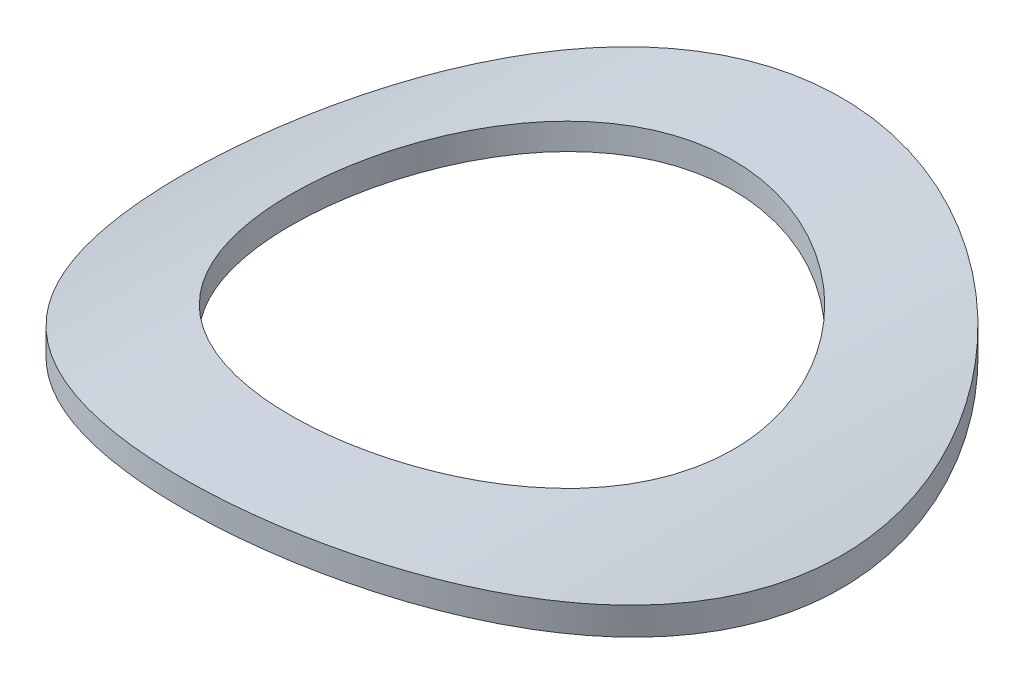
ISO-10303-21;
HEADER;
FILE_DESCRIPTION(('STEP AP214'),'2;1');
FILE_NAME('part.step','',(''),(''),'','','');
FILE_SCHEMA(('AUTOMOTIVE_DESIGN { 1 0 10303 214 1 1 1 1 }'));
ENDSEC;
DATA;
#1=APPLICATION_CONTEXT('core data for automotive mechanical design processes');
#2=APPLICATION_PROTOCOL_DEFINITION('international standard','automotive_design',2000,#1);
#3=PRODUCT_CONTEXT('',#1,'mechanical');
#4=PRODUCT('Part','Part','',(#3));
#5=PRODUCT_RELATED_PRODUCT_CATEGORY('part','',(#4));
#6=PRODUCT_DEFINITION_FORMATION('','',#4);
#7=PRODUCT_DEFINITION_CONTEXT('part definition',#1,'design');
#8=PRODUCT_DEFINITION('design','',#6,#7);
#9=PRODUCT_DEFINITION_SHAPE('','',#8);
#10=(LENGTH_UNIT() NAMED_UNIT(*) SI_UNIT(.MILLI.,.METRE.));
#11=(NAMED_UNIT(*) PLANE_ANGLE_UNIT() SI_UNIT($,.RADIAN.));
#12=(NAMED_UNIT(*) SI_UNIT($,.STERADIAN.) SOLID_ANGLE_UNIT());
#13=UNCERTAINTY_MEASURE_WITH_UNIT(LENGTH_MEASURE(1.E-05),#10,'distance_accuracy_value','');
#14=(GEOMETRIC_REPRESENTATION_CONTEXT(3) GLOBAL_UNCERTAINTY_ASSIGNED_CONTEXT((#13)) GLOBAL_UNIT_ASSIGNED_CONTEXT((#10,
#11,#12)) REPRESENTATION_CONTEXT('',''));
#15=CARTESIAN_POINT('',(0.,0.,0.));
#16=DIRECTION('',(0.,0.,1.));
#17=DIRECTION('',(1.,0.,0.));
#18=AXIS2_PLACEMENT_3D('',#15,#16,#17);
#19=CARTESIAN_POINT('',(0.,-17.25,-7.6));
#20=DIRECTION('',(0.,0.,1.));
#21=DIRECTION('',(1.,0.,0.));
#22=AXIS2_PLACEMENT_3D('',#19,#20,#21);
#23=CYLINDRICAL_SURFACE('',#22,19.45);
#24=CARTESIAN_POINT('',(5.1,1.51945657178172,0.));
#25=CARTESIAN_POINT('',(5.0999995055215,1.51945691479147,0.140459049564521));
#26=CARTESIAN_POINT('',(5.0941924376075,1.52103754174586,0.280929262328434));
#27=CARTESIAN_POINT('',(5.07100961408821,1.52731351725321,0.560894504581965));
#28=CARTESIAN_POINT('',(5.0536289591616,1.53201018488288,0.700389095790963));
#29=CARTESIAN_POINT('',(5.00741209276804,1.54438470539764,0.977542067257098));
#30=CARTESIAN_POINT('',(4.97855930756364,1.55206687105464,1.11519749177534));
#31=CARTESIAN_POINT('',(4.90963193204747,1.57018284917099,1.38753581700298));
#32=CARTESIAN_POINT('',(4.86955301661376,1.58061772208306,1.52221755041175));
#33=CARTESIAN_POINT('',(4.77860264542307,1.60390287113796,1.78732810804574));
#34=CARTESIAN_POINT('',(4.72775629495453,1.61674752084753,1.91776602480149));
#35=CARTESIAN_POINT('',(4.61561545723657,1.64449457072468,2.17386009726463));
#36=CARTESIAN_POINT('',(4.55431710044392,1.6593977326054,2.29951446085244));
#37=CARTESIAN_POINT('',(4.35545880149484,1.70655745749262,2.66789616755649));
#38=CARTESIAN_POINT('',(4.20281775822918,1.74129594913406,2.9023839490367));
#39=CARTESIAN_POINT('',(3.85791962247936,1.81438067490833,3.34778045889317));
#40=CARTESIAN_POINT('',(3.66486599626507,1.85278939379981,3.55805813119978));
#41=CARTESIAN_POINT('',(3.24625726040622,1.92835969212124,3.94370001733728));
#42=CARTESIAN_POINT('',(3.02069710709718,1.96552107691146,4.11905880313067));
#43=CARTESIAN_POINT('',(2.53919520468261,2.03509721029681,4.43240987883686));
#44=CARTESIAN_POINT('',(2.28283842813576,2.06742988535398,4.56978395958309));
#45=CARTESIAN_POINT('',(1.74967938809728,2.12299270365513,4.7992501462647));
#46=CARTESIAN_POINT('',(1.47288061440534,2.14622439634323,4.89134996083421));
#47=CARTESIAN_POINT('',(0.91321173232183,2.18052674138492,5.0256357153759));
#48=CARTESIAN_POINT('',(0.630612516031051,2.19185573195099,5.06888358139553));
#49=CARTESIAN_POINT('',(0.0619570317405978,2.20197857941085,5.10757687551928));
#50=CARTESIAN_POINT('',(-0.224098672677855,2.20077445300421,5.10302999425873));
#51=CARTESIAN_POINT('',(-0.784158017515786,2.18615732041152,5.04701754793936));
#52=CARTESIAN_POINT('',(-1.05828543161784,2.17304286698965,4.99669927219588));
#53=CARTESIAN_POINT('',(-1.59406896440079,2.13642783501373,4.85241318314029));
#54=CARTESIAN_POINT('',(-1.85572430669385,2.11292661081505,4.75844265637331));
#55=CARTESIAN_POINT('',(-2.36206344425537,2.05773764935841,4.5286599533239));
#56=CARTESIAN_POINT('',(-2.60655738880999,2.02597250121336,4.39244965238628));
#57=CARTESIAN_POINT('',(-3.06968933879348,1.95766328235134,4.0822316435626));
#58=CARTESIAN_POINT('',(-3.28832411394838,1.92111861578497,3.90821922119923));
#59=CARTESIAN_POINT('',(-3.59561752020098,1.86505650271099,3.61968900929857));
#60=CARTESIAN_POINT('',(-3.69591170001624,1.8458713545213,3.5172144575119));
#61=CARTESIAN_POINT('',(-3.88753703452479,1.80778253743019,3.30417142160758));
#62=CARTESIAN_POINT('',(-3.97887131794118,1.78887877224213,3.19360578654674));
#63=CARTESIAN_POINT('',(-4.15203074013893,1.75186822047858,2.9650005291287));
#64=CARTESIAN_POINT('',(-4.23384790179827,1.73376211027129,2.84695476322237));
#65=CARTESIAN_POINT('',(-4.38728735966358,1.69888908636681,2.60428608721129));
#66=CARTESIAN_POINT('',(-4.45891360057449,1.68212165560216,2.47966574774045));
#67=CARTESIAN_POINT('',(-4.59193756599135,1.65029953889609,2.22374728651684));
#68=CARTESIAN_POINT('',(-4.6532603983914,1.63525762611291,2.0924086221412));
#69=CARTESIAN_POINT('',(-4.7645548928216,1.6074867778409,1.82482958164356));
#70=CARTESIAN_POINT('',(-4.81453111506859,1.59475691354984,1.68859120031664));
#71=CARTESIAN_POINT('',(-4.90267108404863,1.57201865087814,1.41237340379724));
#72=CARTESIAN_POINT('',(-4.94085422514447,1.56200578757121,1.27240054655474));
#73=CARTESIAN_POINT('',(-5.00516958299292,1.54499635841586,0.989592030091544));
#74=CARTESIAN_POINT('',(-5.03130744982162,1.53799837847682,0.84675774595612));
#75=CARTESIAN_POINT('',(-5.06750973050379,1.52826188749747,0.586648031892184));
#76=CARTESIAN_POINT('',(-5.07968663669637,1.52496615379009,0.469682651317227));
#77=CARTESIAN_POINT('',(-5.0959319941079,1.5205633481283,0.235147456179601));
#78=CARTESIAN_POINT('',(-5.10000041392573,1.51945628464979,0.117577639277946));
#79=CARTESIAN_POINT('',(-5.0999995055215,1.51945691479147,-0.140459049564521));
#80=CARTESIAN_POINT('',(-5.0941924376075,1.52103754174586,-0.280929262328434));
#81=CARTESIAN_POINT('',(-5.07100961408821,1.52731351725321,-0.560894504581965));
#82=CARTESIAN_POINT('',(-5.0536289591616,1.53201018488287,-0.700389095790963));
#83=CARTESIAN_POINT('',(-5.00741209276804,1.54438470539764,-0.977542067257097));
#84=CARTESIAN_POINT('',(-4.97855930756364,1.55206687105464,-1.11519749177534));
#85=CARTESIAN_POINT('',(-4.90963193204747,1.57018284917099,-1.38753581700298));
#86=CARTESIAN_POINT('',(-4.86955301661376,1.58061772208306,-1.52221755041175));
#87=CARTESIAN_POINT('',(-4.77860264542307,1.60390287113796,-1.78732810804574));
#88=CARTESIAN_POINT('',(-4.72775629495453,1.61674752084753,-1.91776602480149));
#89=CARTESIAN_POINT('',(-4.61561545723657,1.64449457072468,-2.17386009726464));
#90=CARTESIAN_POINT('',(-4.55431710044392,1.6593977326054,-2.29951446085244));
#91=CARTESIAN_POINT('',(-4.35545880149484,1.70655745749262,-2.66789616755649));
#92=CARTESIAN_POINT('',(-4.20281775822918,1.74129594913406,-2.9023839490367));
#93=CARTESIAN_POINT('',(-3.85791962247936,1.81438067490833,-3.34778045889317));
#94=CARTESIAN_POINT('',(-3.66486599626507,1.85278939379982,-3.55805813119978));
#95=CARTESIAN_POINT('',(-3.24625726040622,1.92835969212124,-3.94370001733728));
#96=CARTESIAN_POINT('',(-3.02069710709718,1.96552107691146,-4.11905880313066));
#97=CARTESIAN_POINT('',(-2.53919520468261,2.03509721029681,-4.43240987883686));
#98=CARTESIAN_POINT('',(-2.28283842813576,2.06742988535398,-4.56978395958309));
#99=CARTESIAN_POINT('',(-1.74967938809728,2.12299270365513,-4.7992501462647));
#100=CARTESIAN_POINT('',(-1.47288061440533,2.14622439634323,-4.89134996083421));
#101=CARTESIAN_POINT('',(-0.91321173232183,2.18052674138492,-5.0256357153759));
#102=CARTESIAN_POINT('',(-0.630612516031051,2.19185573195099,-5.06888358139553));
#103=CARTESIAN_POINT('',(-0.0619570317405986,2.20197857941085,-5.10757687551928));
#104=CARTESIAN_POINT('',(0.224098672677855,2.20077445300421,-5.10302999425873));
#105=CARTESIAN_POINT('',(0.784158017515786,2.18615732041152,-5.04701754793936));
#106=CARTESIAN_POINT('',(1.05828543161784,2.17304286698965,-4.99669927219588));
#107=CARTESIAN_POINT('',(1.59406896440079,2.13642783501373,-4.85241318314029));
#108=CARTESIAN_POINT('',(1.85572430669385,2.11292661081505,-4.75844265637331));
#109=CARTESIAN_POINT('',(2.36206344425537,2.05773764935841,-4.5286599533239));
#110=CARTESIAN_POINT('',(2.60655738880999,2.02597250121336,-4.39244965238628));
#111=CARTESIAN_POINT('',(3.06968933879348,1.95766328235134,-4.0822316435626));
#112=CARTESIAN_POINT('',(3.28832411394838,1.92111861578497,-3.90821922119923));
#113=CARTESIAN_POINT('',(3.59561752020098,1.86505650271099,-3.61968900929857));
#114=CARTESIAN_POINT('',(3.69591170001624,1.84587135452131,-3.51721445751189));
#115=CARTESIAN_POINT('',(3.88753703452479,1.80778253743019,-3.30417142160758));
#116=CARTESIAN_POINT('',(3.97887131794118,1.78887877224213,-3.19360578654674));
#117=CARTESIAN_POINT('',(4.15203074013893,1.75186822047858,-2.9650005291287));
#118=CARTESIAN_POINT('',(4.23384790179827,1.73376211027129,-2.84695476322237));
#119=CARTESIAN_POINT('',(4.38728735966358,1.6988890863668,-2.60428608721129));
#120=CARTESIAN_POINT('',(4.45891360057449,1.68212165560216,-2.47966574774044));
#121=CARTESIAN_POINT('',(4.59193756599135,1.65029953889609,-2.22374728651684));
#122=CARTESIAN_POINT('',(4.6532603983914,1.63525762611291,-2.0924086221412));
#123=CARTESIAN_POINT('',(4.7645548928216,1.6074867778409,-1.82482958164356));
#124=CARTESIAN_POINT('',(4.81453111506859,1.59475691354984,-1.68859120031664));
#125=CARTESIAN_POINT('',(4.90267108404863,1.57201865087814,-1.41237340379724));
#126=CARTESIAN_POINT('',(4.94085422514447,1.56200578757121,-1.27240054655474));
#127=CARTESIAN_POINT('',(5.00516958299292,1.54499635841586,-0.989592030091542));
#128=CARTESIAN_POINT('',(5.03130744982162,1.53799837847682,-0.846757745956118));
#129=CARTESIAN_POINT('',(5.06750973050379,1.52826188749747,-0.586648031892182));
#130=CARTESIAN_POINT('',(5.07968663669637,1.52496615379009,-0.469682651317224));
#131=CARTESIAN_POINT('',(5.0959319941079,1.5205633481283,-0.235147456179599));
#132=CARTESIAN_POINT('',(5.10000041392573,1.51945628464979,-0.117577639277945));
#133=CARTESIAN_POINT('',(5.1,1.51945657178172,0.));
#134=B_SPLINE_CURVE_WITH_KNOTS('',3,(#24,#25,#26,#27,#28,#29,#30,#31,#32,#33,#34,#35,#36,#37,
#38,#39,#40,#41,#42,#43,#44,#45,#46,#47,#48,#49,#50,#51,#52,#53,#54,#55,#56,#57,#58,#59,#60,#61,
#62,#63,#64,#65,#66,#67,#68,#69,#70,#71,#72,#73,#74,#75,#76,#77,#78,#79,#80,#81,#82,#83,#84,#85,
#86,#87,#88,#89,#90,#91,#92,#93,#94,#95,#96,#97,#98,#99,#100,#101,#102,#103,#104,#105,#106,#107,
#108,#109,#110,#111,#112,#113,#114,#115,#116,#117,#118,#119,#120,#121,#122,#123,#124,#125,#126,
#127,#128,#129,#130,#131,#132,#133),.UNSPECIFIED.,.T.,.F.,(4,2,2,2,2,2,2,2,2,2,2,2,2,2,2,2,2,2,
2,2,2,2,2,2,2,2,2,2,2,2,2,2,2,2,2,2,2,2,2,2,2,2,2,2,2,2,2,2,2,2,2,2,2,2,4),(0.,
0.421268041752624,0.842714527811129,1.26477210105007,1.68699250575988,2.10823909461977,
2.52964197741624,3.37137209843634,4.23159109251464,5.09194370088123,5.96556941520808,
6.83904632987109,7.69314676224187,8.5471097637282,9.38024029971198,10.2134226306119,
11.0547097822138,11.896101914921,12.329680248893,12.7631066378447,13.1968937402841,
13.6305124727762,14.067158149881,14.5036280266644,14.9393762352593,15.3749198388972,
15.7275600581605,16.0802016430643,16.5014696848169,16.9229161708754,17.3449737441144,
17.7671941488242,18.1884407376841,18.6098436204805,19.4515737415006,20.3117927355789,
21.1721453439455,22.0457710582724,22.9192479729354,23.7733484053062,24.6273114067925,
25.4604419427763,26.2936242736762,27.1349114252781,27.9763035579853,28.4098818919573,
28.843308280909,29.2770953833484,29.7107141158405,30.1473597929453,30.5838296697287,
31.0195778783236,31.4551214819615,31.8077617012248,32.1604032861286),.UNSPECIFIED.);
#135=CARTESIAN_POINT('',(5.1,1.51945657178172,0.));
#136=VERTEX_POINT('',#135);
#137=EDGE_CURVE('E30',#136,#136,#134,.T.);
#138=ORIENTED_EDGE('',*,*,#137,.T.);
#139=EDGE_LOOP('',(#138));
#140=FACE_BOUND('',#139,.T.);
#141=CARTESIAN_POINT('',(7.6,0.653700734764303,0.));
#142=CARTESIAN_POINT('',(7.60000082840708,0.653699940658333,0.204262338696853));
#143=CARTESIAN_POINT('',(7.59175816554607,0.657205939323997,0.408513207996823));
#144=CARTESIAN_POINT('',(7.55887642501754,0.671110676428484,0.815525804972903));
#145=CARTESIAN_POINT('',(7.5342318582405,0.681511722379575,1.01828701113874));
#146=CARTESIAN_POINT('',(7.46877007382527,0.708876029999964,1.42096145632324));
#147=CARTESIAN_POINT('',(7.42793459606296,0.725846700384945,1.62087121484879));
#148=CARTESIAN_POINT('',(7.33049357472522,0.765802302335084,2.01627023682255));
#149=CARTESIAN_POINT('',(7.2738817160012,0.788789642096428,2.21175769611239));
#150=CARTESIAN_POINT('',(7.14566096643968,0.839963296910349,2.5962345523922));
#151=CARTESIAN_POINT('',(7.07410835562739,0.86813005548864,2.78524532122871));
#152=CARTESIAN_POINT('',(6.91648614496346,0.928884498257419,3.1564097977865));
#153=CARTESIAN_POINT('',(6.8304110362667,0.96147385916023,3.33856087121406));
#154=CARTESIAN_POINT('',(6.55144717658291,1.06448619826455,3.8729575176302));
#155=CARTESIAN_POINT('',(6.3376901737302,1.14020773704166,4.2135323857874));
#156=CARTESIAN_POINT('',(5.84829227914084,1.30180026154841,4.87174268320073));
#157=CARTESIAN_POINT('',(5.5701191515004,1.38798763335448,5.18741819516329));
#158=CARTESIAN_POINT('',(5.11673990351057,1.51556048315537,5.62344157799068));
#159=CARTESIAN_POINT('',(4.95948003249655,1.5578268731821,5.76261232122527));
#160=CARTESIAN_POINT('',(4.63374418144359,1.64071486539538,6.02763997537671));
#161=CARTESIAN_POINT('',(4.46527240455153,1.68133707487406,6.15350183026145));
#162=CARTESIAN_POINT('',(4.11146340735519,1.76137828121062,6.39558846446134));
#163=CARTESIAN_POINT('',(3.9257289845802,1.80069332960194,6.51126722478913));
#164=CARTESIAN_POINT('',(3.54442904715389,1.87530356631025,6.72643419937395));
#165=CARTESIAN_POINT('',(3.34886756310875,1.91060038363254,6.82592898173956));
#166=CARTESIAN_POINT('',(2.94917751258632,1.9761763535403,7.00789291362318));
#167=CARTESIAN_POINT('',(2.74504957671828,2.00645587465895,7.09036331373485));
#168=CARTESIAN_POINT('',(2.32970005950517,2.06110713017071,7.23747379207806));
#169=CARTESIAN_POINT('',(2.11847890922304,2.08547922282811,7.30211495162172));
#170=CARTESIAN_POINT('',(1.70052618147932,2.12660286108871,7.41030514576674));
#171=CARTESIAN_POINT('',(1.49404152402996,2.14365569999786,7.454694169765));
#172=CARTESIAN_POINT('',(1.07766709955484,2.17124240312634,7.52617078375809));
#173=CARTESIAN_POINT('',(0.86777742902842,2.18177645176053,7.55325886319277));
#174=CARTESIAN_POINT('',(0.446302755223483,2.19602175342244,7.58983174850123));
#175=CARTESIAN_POINT('',(0.234718283637048,2.19973506806409,7.59932187348649));
#176=CARTESIAN_POINT('',(-0.188509363462097,2.20023748637448,7.60060788740271));
#177=CARTESIAN_POINT('',(-0.400152536787321,2.1970268204271,7.59240436506022));
#178=CARTESIAN_POINT('',(-0.810423651818083,2.18413356708439,7.55931614827899));
#179=CARTESIAN_POINT('',(-1.00913814664148,2.17480921347336,7.5353545811796));
#180=CARTESIAN_POINT('',(-1.40377542848444,2.15028380744447,7.47190526473971));
#181=CARTESIAN_POINT('',(-1.59969721401143,2.13508069921948,7.43241208389386));
#182=CARTESIAN_POINT('',(-1.98728019724418,2.09918827626979,7.33828840918381));
#183=CARTESIAN_POINT('',(-2.17894280169708,2.07850080304394,7.28366299603068));
#184=CARTESIAN_POINT('',(-2.55691570860544,2.0321407893903,7.15973148649452));
#185=CARTESIAN_POINT('',(-2.74322394914583,2.00646635729504,7.09041981836999));
#186=CARTESIAN_POINT('',(-3.1119499955221,1.95035287411044,6.93658793173772));
#187=CARTESIAN_POINT('',(-3.29427190052526,1.91984999656532,6.85186131047769));
#188=CARTESIAN_POINT('',(-3.65117128170295,1.85508722102892,6.66852400241803));
#189=CARTESIAN_POINT('',(-3.82574609487283,1.82082604498767,6.56990858932812));
#190=CARTESIAN_POINT('',(-4.16614347214224,1.74936834877224,6.35950366141659));
#191=CARTESIAN_POINT('',(-4.33196554906473,1.71217166549471,6.24771341440126));
#192=CARTESIAN_POINT('',(-4.6539910843718,1.63571577071257,6.01167414707419));
#193=CARTESIAN_POINT('',(-4.81019405879271,1.5964564556151,5.88742450072086));
#194=CARTESIAN_POINT('',(-5.12171594429099,1.5142768615689,5.61897899667899));
#195=CARTESIAN_POINT('',(-5.27635770379492,1.47128185517238,5.47401936531057));
#196=CARTESIAN_POINT('',(-5.57293524634645,1.38514787896648,5.17177052949279));
#197=CARTESIAN_POINT('',(-5.71487476339513,1.34200895535715,5.01448497409105));
#198=CARTESIAN_POINT('',(-5.98538320348433,1.25669673006288,4.6882962532));
#199=CARTESIAN_POINT('',(-6.11393934371681,1.21452438101499,4.51938223223143));
#200=CARTESIAN_POINT('',(-6.35664863185115,1.13238099167278,4.17109736042881));
#201=CARTESIAN_POINT('',(-6.47080735951955,1.09240910198827,3.9917306002381));
#202=CARTESIAN_POINT('',(-6.68685357001989,1.01477555650535,3.61852509604772));
#203=CARTESIAN_POINT('',(-6.78832521764417,0.977205729248827,3.42442603300474));
#204=CARTESIAN_POINT('',(-6.97437438675396,0.906830599920644,3.02755812772828));
#205=CARTESIAN_POINT('',(-7.05895915961184,0.874023254456094,2.82479305236483));
#206=CARTESIAN_POINT('',(-7.21035324383948,0.814327405980907,2.41225990508754));
#207=CARTESIAN_POINT('',(-7.27719150277113,0.787429276567761,2.20250387365791));
#208=CARTESIAN_POINT('',(-7.39252989755894,0.740466499452067,1.77735467285065));
#209=CARTESIAN_POINT('',(-7.4410383368282,0.720398757991867,1.56196410331554));
#210=CARTESIAN_POINT('',(-7.51989763002584,0.687544595909176,1.12325674245395));
#211=CARTESIAN_POINT('',(-7.5499021973274,0.674897242288431,0.899867040973357));
#212=CARTESIAN_POINT('',(-7.58995287653727,0.657975770383791,0.450980227392368));
#213=CARTESIAN_POINT('',(-7.59999908552981,0.653701611369836,0.225483125548448));
#214=CARTESIAN_POINT('',(-7.60000082840708,0.653699940658331,-0.204262338696853));
#215=CARTESIAN_POINT('',(-7.59175816554607,0.657205939323995,-0.408513207996824));
#216=CARTESIAN_POINT('',(-7.55887642501754,0.671110676428483,-0.815525804972904));
#217=CARTESIAN_POINT('',(-7.5342318582405,0.681511722379575,-1.01828701113874));
#218=CARTESIAN_POINT('',(-7.46877007382527,0.708876029999965,-1.42096145632324));
#219=CARTESIAN_POINT('',(-7.42793459606296,0.725846700384946,-1.6208712148488));
#220=CARTESIAN_POINT('',(-7.33049357472522,0.765802302335084,-2.01627023682255));
#221=CARTESIAN_POINT('',(-7.2738817160012,0.788789642096429,-2.21175769611239));
#222=CARTESIAN_POINT('',(-7.14566096643968,0.839963296910351,-2.5962345523922));
#223=CARTESIAN_POINT('',(-7.07410835562739,0.868130055488643,-2.78524532122871));
#224=CARTESIAN_POINT('',(-6.91648614496346,0.928884498257421,-3.15640979778651));
#225=CARTESIAN_POINT('',(-6.83041103626669,0.961473859160232,-3.33856087121407));
#226=CARTESIAN_POINT('',(-6.55144717658291,1.06448619826455,-3.8729575176302));
#227=CARTESIAN_POINT('',(-6.3376901737302,1.14020773704166,-4.2135323857874));
#228=CARTESIAN_POINT('',(-5.84829227914084,1.30180026154841,-4.87174268320073));
#229=CARTESIAN_POINT('',(-5.5701191515004,1.38798763335448,-5.18741819516329));
#230=CARTESIAN_POINT('',(-5.11673990351057,1.51556048315537,-5.62344157799068));
#231=CARTESIAN_POINT('',(-4.95948003249655,1.5578268731821,-5.76261232122527));
#232=CARTESIAN_POINT('',(-4.63374418144359,1.64071486539538,-6.02763997537671));
#233=CARTESIAN_POINT('',(-4.46527240455152,1.68133707487406,-6.15350183026145));
#234=CARTESIAN_POINT('',(-4.11146340735519,1.76137828121062,-6.39558846446134));
#235=CARTESIAN_POINT('',(-3.9257289845802,1.80069332960194,-6.51126722478913));
#236=CARTESIAN_POINT('',(-3.54442904715389,1.87530356631025,-6.72643419937394));
#237=CARTESIAN_POINT('',(-3.34886756310875,1.91060038363254,-6.82592898173956));
#238=CARTESIAN_POINT('',(-2.94917751258631,1.9761763535403,-7.00789291362318));
#239=CARTESIAN_POINT('',(-2.74504957671828,2.00645587465895,-7.09036331373485));
#240=CARTESIAN_POINT('',(-2.32970005950517,2.06110713017071,-7.23747379207806));
#241=CARTESIAN_POINT('',(-2.11847890922304,2.08547922282811,-7.30211495162172));
#242=CARTESIAN_POINT('',(-1.70052618147932,2.12660286108871,-7.41030514576674));
#243=CARTESIAN_POINT('',(-1.49404152402996,2.14365569999786,-7.454694169765));
#244=CARTESIAN_POINT('',(-1.07766709955484,2.17124240312634,-7.52617078375809));
#245=CARTESIAN_POINT('',(-0.867777429028417,2.18177645176053,-7.55325886319277));
#246=CARTESIAN_POINT('',(-0.446302755223478,2.19602175342244,-7.58983174850123));
#247=CARTESIAN_POINT('',(-0.234718283637042,2.19973506806409,-7.59932187348649));
#248=CARTESIAN_POINT('',(0.188509363462102,2.20023748637448,-7.60060788740271));
#249=CARTESIAN_POINT('',(0.400152536787324,2.1970268204271,-7.59240436506022));
#250=CARTESIAN_POINT('',(0.810423651818084,2.18413356708439,-7.55931614827899));
#251=CARTESIAN_POINT('',(1.00913814664148,2.17480921347336,-7.5353545811796));
#252=CARTESIAN_POINT('',(1.40377542848444,2.15028380744447,-7.47190526473971));
#253=CARTESIAN_POINT('',(1.59969721401143,2.13508069921948,-7.43241208389386));
#254=CARTESIAN_POINT('',(1.98728019724418,2.09918827626979,-7.33828840918381));
#255=CARTESIAN_POINT('',(2.17894280169708,2.07850080304394,-7.28366299603068));
#256=CARTESIAN_POINT('',(2.55691570860544,2.0321407893903,-7.15973148649452));
#257=CARTESIAN_POINT('',(2.74322394914583,2.00646635729504,-7.09041981836999));
#258=CARTESIAN_POINT('',(3.1119499955221,1.95035287411044,-6.93658793173772));
#259=CARTESIAN_POINT('',(3.29427190052526,1.91984999656532,-6.85186131047769));
#260=CARTESIAN_POINT('',(3.65117128170296,1.85508722102892,-6.66852400241803));
#261=CARTESIAN_POINT('',(3.82574609487283,1.82082604498767,-6.56990858932812));
#262=CARTESIAN_POINT('',(4.16614347214225,1.74936834877224,-6.35950366141659));
#263=CARTESIAN_POINT('',(4.33196554906473,1.71217166549471,-6.24771341440126));
#264=CARTESIAN_POINT('',(4.6539910843718,1.63571577071257,-6.01167414707418));
#265=CARTESIAN_POINT('',(4.81019405879271,1.5964564556151,-5.88742450072086));
#266=CARTESIAN_POINT('',(5.12171594429099,1.5142768615689,-5.61897899667899));
#267=CARTESIAN_POINT('',(5.27635770379492,1.47128185517238,-5.47401936531057));
#268=CARTESIAN_POINT('',(5.57293524634646,1.38514787896648,-5.17177052949279));
#269=CARTESIAN_POINT('',(5.71487476339513,1.34200895535716,-5.01448497409105));
#270=CARTESIAN_POINT('',(5.98538320348433,1.25669673006288,-4.6882962532));
#271=CARTESIAN_POINT('',(6.11393934371681,1.21452438101499,-4.51938223223143));
#272=CARTESIAN_POINT('',(6.35664863185115,1.13238099167278,-4.17109736042881));
#273=CARTESIAN_POINT('',(6.47080735951955,1.09240910198827,-3.9917306002381));
#274=CARTESIAN_POINT('',(6.68685357001989,1.01477555650535,-3.61852509604772));
#275=CARTESIAN_POINT('',(6.78832521764417,0.977205729248828,-3.42442603300473));
#276=CARTESIAN_POINT('',(6.97437438675396,0.906830599920645,-3.02755812772827));
#277=CARTESIAN_POINT('',(7.05895915961184,0.874023254456096,-2.82479305236482));
#278=CARTESIAN_POINT('',(7.21035324383948,0.814327405980907,-2.41225990508754));
#279=CARTESIAN_POINT('',(7.27719150277113,0.78742927656776,-2.20250387365791));
#280=CARTESIAN_POINT('',(7.39252989755894,0.740466499452067,-1.77735467285065));
#281=CARTESIAN_POINT('',(7.4410383368282,0.720398757991869,-1.56196410331554));
#282=CARTESIAN_POINT('',(7.51989763002585,0.687544595909176,-1.12325674245395));
#283=CARTESIAN_POINT('',(7.5499021973274,0.674897242288428,-0.899867040973354));
#284=CARTESIAN_POINT('',(7.58995287653727,0.657975770383788,-0.450980227392366));
#285=CARTESIAN_POINT('',(7.59999908552981,0.653701611369835,-0.225483125548447));
#286=CARTESIAN_POINT('',(7.6,0.653700734764303,0.));
#287=B_SPLINE_CURVE_WITH_KNOTS('',3,(#141,#142,#143,#144,#145,#146,#147,#148,#149,#150,#151,
#152,#153,#154,#155,#156,#157,#158,#159,#160,#161,#162,#163,#164,#165,#166,#167,#168,#169,#170,
#171,#172,#173,#174,#175,#176,#177,#178,#179,#180,#181,#182,#183,#184,#185,#186,#187,#188,#189,
#190,#191,#192,#193,#194,#195,#196,#197,#198,#199,#200,#201,#202,#203,#204,#205,#206,#207,#208,
#209,#210,#211,#212,#213,#214,#215,#216,#217,#218,#219,#220,#221,#222,#223,#224,#225,#226,#227,
#228,#229,#230,#231,#232,#233,#234,#235,#236,#237,#238,#239,#240,#241,#242,#243,#244,#245,#246,
#247,#248,#249,#250,#251,#252,#253,#254,#255,#256,#257,#258,#259,#260,#261,#262,#263,#264,#265,
#266,#267,#268,#269,#270,#271,#272,#273,#274,#275,#276,#277,#278,#279,#280,#281,#282,#283,#284,
#285,#286),.UNSPECIFIED.,.T.,.F.,(4,2,2,2,2,2,2,2,2,2,2,2,2,2,2,2,2,2,2,2,2,2,2,2,2,2,2,2,2,2,2,
2,2,2,2,2,2,2,2,2,2,2,2,2,2,2,2,2,2,2,2,2,2,2,2,2,2,2,2,2,2,2,2,2,2,2,2,2,2,2,2,2,4),(0.,
0.612572132762226,1.2253493738759,1.83881968051122,2.45253590760196,3.06398074808422,
3.67565805266354,4.89779505361605,6.18021019925017,6.82224959979413,7.46404965227148,
8.1301734112275,8.79602615223332,9.46182996295957,10.1275933849706,10.7624440044546,
11.3972766633609,12.0319174081191,12.6665370365933,13.2669441925588,13.8675615017468,
14.4679773950388,15.0686214861458,15.6779954696149,16.2875773234812,16.897193070956,
17.50683946487,18.1549376076639,18.8028446028267,19.4513648601337,20.0996330037616,
20.7654497245136,21.430979919841,22.0954177592747,22.7595542463247,23.4357697047914,
24.1119818739084,24.7245540066706,25.3373312477843,25.9508015544196,26.5645177815104,
27.1759626219926,27.7876399265719,29.0097769275244,30.2921920731586,30.9342314737025,
31.5760315261799,32.2421552851359,32.9080080261417,33.573811836868,34.239575258879,
34.874425878363,35.5092585372693,36.1438992820275,36.7785189105017,37.3789260664672,
37.9795433756552,38.5799592689472,39.1806033600541,39.7899773435233,40.3995591973896,
41.0091749448644,41.6188213387784,42.2669194815723,42.9148264767351,43.5633467340421,
44.21161487767,44.877431598422,45.5429617937494,46.2073996331831,46.8715361202331,
47.5477515786998,48.2239637478168),.UNSPECIFIED.);
#288=CARTESIAN_POINT('',(7.6,0.653700734764303,0.));
#289=VERTEX_POINT('',#288);
#290=EDGE_CURVE('E19',#289,#289,#287,.T.);
#291=ORIENTED_EDGE('',*,*,#290,.F.);
#292=EDGE_LOOP('',(#291));
#293=FACE_BOUND('',#292,.T.);
#294=ADVANCED_FACE('F15',(#140,#293),#23,.T.);
#295=CARTESIAN_POINT('',(0.,0.,0.));
#296=DIRECTION('',(0.,-1.,0.));
#297=DIRECTION('',(0.,0.,-1.));
#298=AXIS2_PLACEMENT_3D('',#295,#296,#297);
#299=CYLINDRICAL_SURFACE('',#298,7.6);
#300=CARTESIAN_POINT('',(-7.6,0.,-7.36903778873255E-12));
#301=CARTESIAN_POINT('',(-7.60000110964854,-1.10445191078352E-06,0.203660363123225));
#302=CARTESIAN_POINT('',(-7.5918067072255,0.00361660802503066,0.407305800548011));
#303=CARTESIAN_POINT('',(-7.55912075671777,0.017962107312225,0.813102730656948));
#304=CARTESIAN_POINT('',(-7.53462393077742,0.0286921967264984,1.01525371808073));
#305=CARTESIAN_POINT('',(-7.46956312988187,0.0569171030610864,1.4166942061986));
#306=CARTESIAN_POINT('',(-7.42898158240564,0.0744193180138727,1.61598032945452));
#307=CARTESIAN_POINT('',(-7.33216026694697,0.11561803150487,2.01013209502748));
#308=CARTESIAN_POINT('',(-7.27591419687139,0.139317022872361,2.20499592398775));
#309=CARTESIAN_POINT('',(-7.14855179665447,0.192059362648362,2.58820566578004));
#310=CARTESIAN_POINT('',(-7.07749386684327,0.221081669834561,2.77657388777486));
#311=CARTESIAN_POINT('',(-6.92098440683489,0.283669522206381,3.14648326657419));
#312=CARTESIAN_POINT('',(-6.83552740616438,0.317236793152167,3.32802179646586));
#313=CARTESIAN_POINT('',(-6.55859764275809,0.423325663150643,3.86066511713375));
#314=CARTESIAN_POINT('',(-6.34644106036098,0.501288635570473,4.20017080577795));
#315=CARTESIAN_POINT('',(-5.85997049345206,0.667937021681687,4.85764120282315));
#316=CARTESIAN_POINT('',(-5.58297381035923,0.756970743956226,5.17353322942833));
#317=CARTESIAN_POINT('',(-5.13135679759037,0.888809536440609,5.61009546118126));
#318=CARTESIAN_POINT('',(-4.97468325761184,0.932498488226891,5.74948243721352));
#319=CARTESIAN_POINT('',(-4.65010081145651,1.018201527791,6.01502059773125));
#320=CARTESIAN_POINT('',(-4.48219610718955,1.06021623266967,6.14117668742023));
#321=CARTESIAN_POINT('',(-4.12901322334037,1.1431504598173,6.38428330197038));
#322=CARTESIAN_POINT('',(-3.94330598059104,1.18395569508511,6.50064968318985));
#323=CARTESIAN_POINT('',(-3.56194638424544,1.2614254364722,6.71718625748893));
#324=CARTESIAN_POINT('',(-3.36629813027619,1.29809162973517,6.8173630569564));
#325=CARTESIAN_POINT('',(-2.96631693043201,1.36624593382062,7.00066815237842));
#326=CARTESIAN_POINT('',(-2.76198477109024,1.39773451234611,7.08379798838294));
#327=CARTESIAN_POINT('',(-2.34610763547543,1.45460667221757,7.23218580481837));
#328=CARTESIAN_POINT('',(-2.13456312920306,1.47999065051174,7.29744494731938));
#329=CARTESIAN_POINT('',(-1.71644367253024,1.52280735101844,7.40663151340409));
#330=CARTESIAN_POINT('',(-1.51013466932235,1.54056926971647,7.4514489580639));
#331=CARTESIAN_POINT('',(-1.09404375914553,1.56937960971294,7.52380578811857));
#332=CARTESIAN_POINT('',(-0.884261956326319,1.58042823197068,7.55134569070916));
#333=CARTESIAN_POINT('',(-0.462948338145353,1.59549278447886,7.58883345049666));
#334=CARTESIAN_POINT('',(-0.251417107757831,1.59951097706396,7.59878696685865));
#335=CARTESIAN_POINT('',(0.171749664454856,1.60040484643511,7.60100425206243));
#336=CARTESIAN_POINT('',(0.383385202272128,1.59728077906384,7.59326865454545));
#337=CARTESIAN_POINT('',(0.79295177782019,1.58436429929951,7.56114909607648));
#338=CARTESIAN_POINT('',(0.990972984155018,1.57496439902087,7.53774488067175));
#339=CARTESIAN_POINT('',(1.38426585268367,1.55013680312444,7.47552393300693));
#340=CARTESIAN_POINT('',(1.57953653158092,1.53470700581323,7.43670182683383));
#341=CARTESIAN_POINT('',(1.96586497552157,1.49821358621439,7.34403320761501));
#342=CARTESIAN_POINT('',(2.1569241383618,1.47715186458454,7.29019176302048));
#343=CARTESIAN_POINT('',(2.5337456541439,1.42990117233143,7.16794148111363));
#344=CARTESIAN_POINT('',(2.71950596399855,1.40371025384914,7.0995271087317));
#345=CARTESIAN_POINT('',(3.0872319167919,1.34641461403391,6.94760084297271));
#346=CARTESIAN_POINT('',(3.26910129820032,1.31524316778397,6.86388132089124));
#347=CARTESIAN_POINT('',(3.62517448924776,1.24901132862894,6.68266662954091));
#348=CARTESIAN_POINT('',(3.7993756660297,1.21394961433531,6.58516677647545));
#349=CARTESIAN_POINT('',(4.1391225265299,1.14076848899257,6.37709562049383));
#350=CARTESIAN_POINT('',(4.30466766095957,1.1026488842862,6.26652348949532));
#351=CARTESIAN_POINT('',(4.6262533238595,1.02423537256358,6.03301513451128));
#352=CARTESIAN_POINT('',(4.78229334347085,0.983941349356642,5.91007824950768));
#353=CARTESIAN_POINT('',(5.09415761674002,0.899376599184187,5.64396394230083));
#354=CARTESIAN_POINT('',(5.24927415676832,0.855019831101799,5.49998357043568));
#355=CARTESIAN_POINT('',(5.54688779456695,0.766066629857335,5.1996840469532));
#356=CARTESIAN_POINT('',(5.68938854246337,0.721470270003377,5.04336848919367));
#357=CARTESIAN_POINT('',(5.96112252843501,0.633175061009099,4.71908979880484));
#358=CARTESIAN_POINT('',(6.09034274486046,0.589477125728997,4.55111549995676));
#359=CARTESIAN_POINT('',(6.33448797752857,0.504252399569463,4.20465868206748));
#360=CARTESIAN_POINT('',(6.4494185102981,0.462724774454049,4.02618025759094));
#361=CARTESIAN_POINT('',(6.66748675247457,0.381819482721662,3.65410862818575));
#362=CARTESIAN_POINT('',(6.77016210668684,0.342544965561679,3.46022141571173));
#363=CARTESIAN_POINT('',(6.95862394475997,0.268855370464258,3.06361438579012));
#364=CARTESIAN_POINT('',(7.04441772204778,0.2344381958116,2.86089842910325));
#365=CARTESIAN_POINT('',(7.19821356140666,0.171685251407236,2.44828740997865));
#366=CARTESIAN_POINT('',(7.26624460736545,0.143339588372146,2.23840468272808));
#367=CARTESIAN_POINT('',(7.38392686190455,0.0937080111782555,1.81282672680333));
#368=CARTESIAN_POINT('',(7.4335863693419,0.0724189098574111,1.5971341699208));
#369=CARTESIAN_POINT('',(7.51564812930471,0.0369785476712854,1.15249727442911));
#370=CARTESIAN_POINT('',(7.54724168796776,0.0231630846045603,0.923376006210295));
#371=CARTESIAN_POINT('',(7.58941688522131,0.00467448507962788,0.462830053111906));
#372=CARTESIAN_POINT('',(7.59999873918076,1.25491398182769E-06,0.231405391866439));
#373=CARTESIAN_POINT('',(7.60000110964962,-1.10445238624789E-06,-0.203660363082601));
#374=CARTESIAN_POINT('',(7.59180670722768,0.00361660802407487,-0.407305800507213));
#375=CARTESIAN_POINT('',(7.55912075672218,0.0179621073102994,-0.81310273061591));
#376=CARTESIAN_POINT('',(7.53462393078295,0.0286921967240835,-1.01525371803963));
#377=CARTESIAN_POINT('',(7.46956312988966,0.056917103057717,-1.4166942061575));
#378=CARTESIAN_POINT('',(7.42898158241456,0.0744193180100386,-1.61598032941347));
#379=CARTESIAN_POINT('',(7.33216026695816,0.115618031500143,-2.01013209498665));
#380=CARTESIAN_POINT('',(7.27591419688371,0.139317022867206,-2.20499592394708));
#381=CARTESIAN_POINT('',(7.14855179666903,0.192059362642393,-2.5882056657398));
#382=CARTESIAN_POINT('',(7.07749386685895,0.221081669828206,-2.77657388773487));
#383=CARTESIAN_POINT('',(6.92098440685279,0.283669522199312,-3.14648326653481));
#384=CARTESIAN_POINT('',(6.83552740618338,0.317236793144771,-3.32802179642683));
#385=CARTESIAN_POINT('',(6.55859764278037,0.423325663142355,-3.86066511709587));
#386=CARTESIAN_POINT('',(6.34644106038541,0.501288635561713,-4.20017080574101));
#387=CARTESIAN_POINT('',(5.85997049348088,0.667937021672226,-4.85764120278834));
#388=CARTESIAN_POINT('',(5.58297381039031,0.756970743946551,-5.17353322939475));
#389=CARTESIAN_POINT('',(5.13135679762475,0.888809536430871,-5.61009546114981));
#390=CARTESIAN_POINT('',(4.97468325764731,0.932498488217176,-5.74948243718282));
#391=CARTESIAN_POINT('',(4.65010081149411,1.01820152778141,-6.01502059770217));
#392=CARTESIAN_POINT('',(4.48219610722821,1.0602162326602,-6.141176687392));
#393=CARTESIAN_POINT('',(4.12901322338085,1.14315045980821,-6.3842833019442));
#394=CARTESIAN_POINT('',(3.94330598063226,1.18395569507629,-6.50064968316484));
#395=CARTESIAN_POINT('',(3.56194638428807,1.26142543646399,-6.71718625746632));
#396=CARTESIAN_POINT('',(3.36629813031947,1.29809162972731,-6.81736305693502));
#397=CARTESIAN_POINT('',(2.96631693047649,1.36624593381352,-7.00066815235957));
#398=CARTESIAN_POINT('',(2.76198477113528,1.39773451233944,-7.08379798836538));
#399=CARTESIAN_POINT('',(2.34610763552145,1.4546066722118,-7.23218580480344));
#400=CARTESIAN_POINT('',(2.13456312924951,1.47999065050644,-7.29744494730579));
#401=CARTESIAN_POINT('',(1.71644367257716,1.52280735101414,-7.40663151339323));
#402=CARTESIAN_POINT('',(1.51013466936931,1.5405692697127,-7.45144895805439));
#403=CARTESIAN_POINT('',(1.09404375919243,1.56937960971022,-7.52380578811176));
#404=CARTESIAN_POINT('',(0.884261956373115,1.58042823196848,-7.55134569070369));
#405=CARTESIAN_POINT('',(0.462948338191828,1.59549278447772,-7.58883345049383));
#406=CARTESIAN_POINT('',(0.251417107804082,1.59951097706335,-7.59878696685713));
#407=CARTESIAN_POINT('',(-0.171749664409179,1.60040484643552,-7.60100425206347));
#408=CARTESIAN_POINT('',(-0.3833852022268,1.59728077906476,-7.59326865454775));
#409=CARTESIAN_POINT('',(-0.792951777775475,1.58436429930139,-7.56114909608117));
#410=CARTESIAN_POINT('',(-0.990972984110562,1.57496439902321,-7.5377448806776));
#411=CARTESIAN_POINT('',(-1.38426585263982,1.55013680312767,-7.47552393301505));
#412=CARTESIAN_POINT('',(-1.57953653153744,1.53470700581689,-7.43670182684307));
#413=CARTESIAN_POINT('',(-1.96586497547889,1.49821358621887,-7.34403320762644));
#414=CARTESIAN_POINT('',(-2.15692413831957,1.47715186458941,-7.29019176303298));
#415=CARTESIAN_POINT('',(-2.53374565410265,1.42990117233703,-7.16794148112822));
#416=CARTESIAN_POINT('',(-2.71950596395783,1.40371025385508,-7.09952710874731));
#417=CARTESIAN_POINT('',(-3.08723191675204,1.34641461404053,-6.94760084299042));
#418=CARTESIAN_POINT('',(-3.26910129816081,1.31524316779092,-6.86388132091005));
#419=CARTESIAN_POINT('',(-3.62517448920904,1.24901132863653,-6.68266662956191));
#420=CARTESIAN_POINT('',(-3.79937566599143,1.21394961434319,-6.58516677649752));
#421=CARTESIAN_POINT('',(-4.1391225264926,1.14076848900097,-6.37709562051804));
#422=CARTESIAN_POINT('',(-4.30466766092279,1.10264888429483,-6.26652348952059));
#423=CARTESIAN_POINT('',(-4.62625332382384,1.02423537257261,-6.03301513453862));
#424=CARTESIAN_POINT('',(-4.78229334343579,0.983941349365842,-5.91007824953604));
#425=CARTESIAN_POINT('',(-5.09415761670625,0.899376599193672,-5.64396394233131));
#426=CARTESIAN_POINT('',(-5.24927415673524,0.855019831111397,-5.49998357046725));
#427=CARTESIAN_POINT('',(-5.54688779453534,0.76606662986707,-5.19968404698691));
#428=CARTESIAN_POINT('',(-5.68938854243255,0.721470270013136,-5.04336848922843));
#429=CARTESIAN_POINT('',(-5.96112252840585,0.633175061018822,-4.71908979884167));
#430=CARTESIAN_POINT('',(-6.09034274483216,0.589477125738658,-4.55111549999461));
#431=CARTESIAN_POINT('',(-6.33448797750212,0.504252399578905,-4.20465868210731));
#432=CARTESIAN_POINT('',(-6.44941851027262,0.462724774463333,-4.02618025763174));
#433=CARTESIAN_POINT('',(-6.66748675245131,0.381819482730465,-3.65410862822819));
#434=CARTESIAN_POINT('',(-6.77016210666482,0.342544965570158,-3.46022141575481));
#435=CARTESIAN_POINT('',(-6.95862394474047,0.268855370472008,-3.0636143858344));
#436=CARTESIAN_POINT('',(-7.04441772202958,0.234438195818943,-2.86089842914807));
#437=CARTESIAN_POINT('',(-7.19821356139109,0.171685251413677,-2.44828741002442));
#438=CARTESIAN_POINT('',(-7.26624460735123,0.143339588378094,-2.23840468277427));
#439=CARTESIAN_POINT('',(-7.38392686189304,0.0937080111831582,-1.8128267268502));
#440=CARTESIAN_POINT('',(-7.43358636933177,0.0724189098617628,-1.59713416996795));
#441=CARTESIAN_POINT('',(-7.51564812930007,0.0369785476733146,-1.15249727446229));
#442=CARTESIAN_POINT('',(-7.54724168796594,0.0231630846053568,-0.923376006228924));
#443=CARTESIAN_POINT('',(-7.58941688522241,0.0046744850791399,-0.462830053101138));
#444=CARTESIAN_POINT('',(-7.59999873918199,1.25491344181038E-06,-0.231405391840819));
#445=CARTESIAN_POINT('',(-7.6,0.,-7.36903778873255E-12));
#446=B_SPLINE_CURVE_WITH_KNOTS('',3,(#300,#301,#302,#303,#304,#305,#306,#307,#308,#309,#310,
#311,#312,#313,#314,#315,#316,#317,#318,#319,#320,#321,#322,#323,#324,#325,#326,#327,#328,#329,
#330,#331,#332,#333,#334,#335,#336,#337,#338,#339,#340,#341,#342,#343,#344,#345,#346,#347,#348,
#349,#350,#351,#352,#353,#354,#355,#356,#357,#358,#359,#360,#361,#362,#363,#364,#365,#366,#367,
#368,#369,#370,#371,#372,#373,#374,#375,#376,#377,#378,#379,#380,#381,#382,#383,#384,#385,#386,
#387,#388,#389,#390,#391,#392,#393,#394,#395,#396,#397,#398,#399,#400,#401,#402,#403,#404,#405,
#406,#407,#408,#409,#410,#411,#412,#413,#414,#415,#416,#417,#418,#419,#420,#421,#422,#423,#424,
#425,#426,#427,#428,#429,#430,#431,#432,#433,#434,#435,#436,#437,#438,#439,#440,#441,#442,#443,
#444,#445),.UNSPECIFIED.,.T.,.F.,(4,2,2,2,2,2,2,2,2,2,2,2,2,2,2,2,2,2,2,2,2,2,2,2,2,2,2,2,2,2,2,
2,2,2,2,2,2,2,2,2,2,2,2,2,2,2,2,2,2,2,2,2,2,2,2,2,2,2,2,2,2,2,2,2,2,2,2,2,2,2,2,2,4),(0.,
0.610759719268354,1.22171726622911,1.83334413085741,2.44521741930926,3.05472235708914,
3.66445938135635,4.88275547606328,6.16514023220388,6.80717218144485,7.44896525676555,
8.1168958132238,8.7845531191797,9.45215008130715,10.1197036215727,10.7544820243969,
11.3892414244985,12.0237965266344,12.6583288987462,13.2564882319956,13.8548562371963,
14.4530225598943,15.0514164837193,15.6586286969942,16.266047794175,16.8735053898349,
17.4809954773737,18.1289796451075,18.7767757147096,19.4252010115393,20.0733752016175,
20.7411723448213,21.4086803399472,22.0750922409917,22.7412027394281,23.4351745003124,
24.1291391479828,24.7398988672505,25.3508564142106,25.9624832788383,26.5743565672895,
27.1838615050687,27.7935985293353,29.011894624041,30.2942793801798,30.9363113294199,
31.5781044047397,32.2460349611981,32.9136922671541,33.5812892292816,34.2488427695473,
34.8836211723724,35.5183805724749,36.1529356746117,36.7874680467244,37.3856273799741,
37.983995385175,38.5821617078734,39.1805556316986,39.787767844973,40.3951869421531,
41.0026445378125,41.6101346253507,42.2581187930838,42.9059148626851,43.5543401595141,
44.2025143495915,44.8703114927955,45.5378194879216,46.2042313889663,46.8703418874031,
47.5643136483316,48.2582782960463),.UNSPECIFIED.);
#447=CARTESIAN_POINT('',(-7.6,0.,-7.36903778873255E-12));
#448=VERTEX_POINT('',#447);
#449=EDGE_CURVE('E25',#448,#448,#446,.T.);
#450=ORIENTED_EDGE('',*,*,#449,.T.);
#451=EDGE_LOOP('',(#450));
#452=FACE_BOUND('',#451,.T.);
#453=ORIENTED_EDGE('',*,*,#290,.T.);
#454=EDGE_LOOP('',(#453));
#455=FACE_BOUND('',#454,.T.);
#456=ADVANCED_FACE('F49',(#452,#455),#299,.T.);
#457=CARTESIAN_POINT('',(0.,0.,0.));
#458=DIRECTION('',(0.,-1.,0.));
#459=DIRECTION('',(0.,0.,-1.));
#460=AXIS2_PLACEMENT_3D('',#457,#458,#459);
#461=CYLINDRICAL_SURFACE('',#460,5.1);
#462=CARTESIAN_POINT('',(-5.1,0.896969443959507,0.));
#463=CARTESIAN_POINT('',(-5.09999954002124,0.896969773556659,-0.140281497956878));
#464=CARTESIAN_POINT('',(-5.09420710752185,0.898600517474037,-0.280573189071398));
#465=CARTESIAN_POINT('',(-5.07108352649526,0.905075141167594,-0.560180242088651));
#466=CARTESIAN_POINT('',(-5.05374754392645,0.909920367055116,-0.699495170247776));
#467=CARTESIAN_POINT('',(-5.00765200487574,0.922685362758384,-0.976284992919407));
#468=CARTESIAN_POINT('',(-4.97887611610217,0.930609527883418,-1.1137569649936));
#469=CARTESIAN_POINT('',(-4.9101364841274,0.949294674776387,-1.38572894184214));
#470=CARTESIAN_POINT('',(-4.87016842128329,0.960056751748589,-1.52022777746054));
#471=CARTESIAN_POINT('',(-4.77947856418527,0.98406915458746,-1.78496710436599));
#472=CARTESIAN_POINT('',(-4.72878257330377,0.997313501383376,-1.91521696306866));
#473=CARTESIAN_POINT('',(-4.61698029350828,1.02592179391035,-2.17094461712819));
#474=CARTESIAN_POINT('',(-4.55587014740266,1.04128652458605,-2.29642062320706));
#475=CARTESIAN_POINT('',(-4.35763146832896,1.08990435479187,-2.66429489103704));
#476=CARTESIAN_POINT('',(-4.20547866539949,1.12571335127689,-2.89847632705149));
#477=CARTESIAN_POINT('',(-3.86145069096722,1.20110653442478,-3.34369462101812));
#478=CARTESIAN_POINT('',(-3.66872959060966,1.24075943610503,-3.55406194127809));
#479=CARTESIAN_POINT('',(-3.25077553350272,1.31879329785932,-3.93996560238889));
#480=CARTESIAN_POINT('',(-3.02553735661454,1.3571740524901,-4.11549633997357));
#481=CARTESIAN_POINT('',(-2.544366995921,1.42909927029189,-4.42945464584167));
#482=CARTESIAN_POINT('',(-2.28798959505468,1.46255346265584,-4.56722206306946));
#483=CARTESIAN_POINT('',(-1.7546544477856,1.52006956722981,-4.79744713341129));
#484=CARTESIAN_POINT('',(-1.47770043575362,1.54413317876811,-4.88991298511322));
#485=CARTESIAN_POINT('',(-0.917994199413523,1.57967169134959,-5.02475766798618));
#486=CARTESIAN_POINT('',(-0.635531997297357,1.59142963472695,-5.06826446305631));
#487=CARTESIAN_POINT('',(-0.067088628440014,1.60202237323471,-5.10750697046138));
#488=CARTESIAN_POINT('',(0.218891928103125,1.6008593785786,-5.10325085296299));
#489=CARTESIAN_POINT('',(0.77839140187721,1.58594834238567,-5.04788104349513));
#490=CARTESIAN_POINT('',(1.05204109856428,1.57252777243263,-4.99798656798731));
#491=CARTESIAN_POINT('',(1.5869366960084,1.53499536073152,-4.85471845143692));
#492=CARTESIAN_POINT('',(1.84818180483611,1.51088283740476,-4.76134203853738));
#493=CARTESIAN_POINT('',(2.35391371998977,1.45419959495355,-4.53287133864949));
#494=CARTESIAN_POINT('',(2.59820300627424,1.42154532543181,-4.39736231637394));
#495=CARTESIAN_POINT('',(3.06106526851024,1.35126893144439,-4.08866635276552));
#496=CARTESIAN_POINT('',(3.27963472426973,1.31364612844326,-3.91547426309055));
#497=CARTESIAN_POINT('',(3.5871651831538,1.25584133679541,-3.62806423150235));
#498=CARTESIAN_POINT('',(3.68767560794711,1.23602669816037,-3.52584738248023));
#499=CARTESIAN_POINT('',(3.87975646423997,1.19666846275433,-3.31330255400749));
#500=CARTESIAN_POINT('',(3.97133000306042,1.17712477381749,-3.20297741733533));
#501=CARTESIAN_POINT('',(4.14499284121746,1.13884056098904,-2.9748299216001));
#502=CARTESIAN_POINT('',(4.22707415839567,1.12010072127736,-2.85700138005858));
#503=CARTESIAN_POINT('',(4.38106577240664,1.0839852492784,-2.61473755172382));
#504=CARTESIAN_POINT('',(4.45298001203077,1.06660908932575,-2.49030485191298));
#505=CARTESIAN_POINT('',(4.58665155413733,1.03359666806493,-2.23463561064524));
#506=CARTESIAN_POINT('',(4.64832639766342,1.01797483184663,-2.10335406297391));
#507=CARTESIAN_POINT('',(4.76032568805288,0.989110315170547,-1.83584203960714));
#508=CARTESIAN_POINT('',(4.81065471318359,0.975866675502779,-1.69961358594651));
#509=CARTESIAN_POINT('',(4.89949408995769,0.952185842030566,-1.42336740594889));
#510=CARTESIAN_POINT('',(4.938023821767,0.941744049763765,-1.28335630875092));
#511=CARTESIAN_POINT('',(5.00301922338467,0.923976940957081,-1.0004263392175));
#512=CARTESIAN_POINT('',(5.02949053549594,0.916650166963889,-0.857508859589428));
#513=CARTESIAN_POINT('',(5.06651156353631,0.906355748969136,-0.595561898499215));
#514=CARTESIAN_POINT('',(5.07906229264845,0.902842789393913,-0.476832364833095));
#515=CARTESIAN_POINT('',(5.09580672404212,0.898149491782435,-0.238737682888593));
#516=CARTESIAN_POINT('',(5.1000003914189,0.896969163488829,-0.11937253195753));
#517=CARTESIAN_POINT('',(5.09999954002124,0.896969773556658,0.140281497956879));
#518=CARTESIAN_POINT('',(5.09420710752184,0.898600517474038,0.280573189071399));
#519=CARTESIAN_POINT('',(5.07108352649526,0.905075141167595,0.560180242088653));
#520=CARTESIAN_POINT('',(5.05374754392645,0.909920367055116,0.699495170247778));
#521=CARTESIAN_POINT('',(5.00765200487574,0.922685362758381,0.976284992919408));
#522=CARTESIAN_POINT('',(4.97887611610217,0.930609527883415,1.1137569649936));
#523=CARTESIAN_POINT('',(4.9101364841274,0.949294674776386,1.38572894184214));
#524=CARTESIAN_POINT('',(4.87016842128329,0.960056751748589,1.52022777746054));
#525=CARTESIAN_POINT('',(4.77947856418527,0.98406915458746,1.78496710436599));
#526=CARTESIAN_POINT('',(4.72878257330377,0.997313501383375,1.91521696306866));
#527=CARTESIAN_POINT('',(4.61698029350828,1.02592179391035,2.17094461712819));
#528=CARTESIAN_POINT('',(4.55587014740266,1.04128652458606,2.29642062320706));
#529=CARTESIAN_POINT('',(4.35763146832895,1.08990435479188,2.66429489103704));
#530=CARTESIAN_POINT('',(4.20547866539949,1.1257133512769,2.89847632705149));
#531=CARTESIAN_POINT('',(3.86145069096722,1.20110653442478,3.34369462101812));
#532=CARTESIAN_POINT('',(3.66872959060966,1.24075943610503,3.55406194127809));
#533=CARTESIAN_POINT('',(3.25077553350272,1.31879329785932,3.93996560238889));
#534=CARTESIAN_POINT('',(3.02553735661454,1.3571740524901,4.11549633997357));
#535=CARTESIAN_POINT('',(2.54436699592099,1.42909927029189,4.42945464584167));
#536=CARTESIAN_POINT('',(2.28798959505468,1.46255346265584,4.56722206306946));
#537=CARTESIAN_POINT('',(1.7546544477856,1.52006956722982,4.79744713341129));
#538=CARTESIAN_POINT('',(1.47770043575362,1.54413317876811,4.88991298511322));
#539=CARTESIAN_POINT('',(0.917994199413523,1.57967169134959,5.02475766798618));
#540=CARTESIAN_POINT('',(0.635531997297357,1.59142963472695,5.06826446305631));
#541=CARTESIAN_POINT('',(0.0670886284400144,1.60202237323472,5.10750697046138));
#542=CARTESIAN_POINT('',(-0.218891928103125,1.6008593785786,5.10325085296299));
#543=CARTESIAN_POINT('',(-0.77839140187721,1.58594834238567,5.04788104349513));
#544=CARTESIAN_POINT('',(-1.05204109856428,1.57252777243263,4.99798656798731));
#545=CARTESIAN_POINT('',(-1.5869366960084,1.53499536073152,4.85471845143692));
#546=CARTESIAN_POINT('',(-1.84818180483611,1.51088283740476,4.76134203853738));
#547=CARTESIAN_POINT('',(-2.35391371998977,1.45419959495355,4.53287133864949));
#548=CARTESIAN_POINT('',(-2.59820300627424,1.4215453254318,4.39736231637394));
#549=CARTESIAN_POINT('',(-3.06106526851024,1.35126893144438,4.08866635276552));
#550=CARTESIAN_POINT('',(-3.27963472426973,1.31364612844326,3.91547426309055));
#551=CARTESIAN_POINT('',(-3.5871651831538,1.2558413367954,3.62806423150235));
#552=CARTESIAN_POINT('',(-3.68767560794711,1.23602669816037,3.52584738248023));
#553=CARTESIAN_POINT('',(-3.87975646423997,1.19666846275433,3.31330255400748));
#554=CARTESIAN_POINT('',(-3.97133000306042,1.17712477381749,3.20297741733533));
#555=CARTESIAN_POINT('',(-4.14499284121746,1.13884056098904,2.9748299216001));
#556=CARTESIAN_POINT('',(-4.22707415839567,1.12010072127735,2.85700138005858));
#557=CARTESIAN_POINT('',(-4.38106577240664,1.0839852492784,2.61473755172382));
#558=CARTESIAN_POINT('',(-4.45298001203077,1.06660908932575,2.49030485191298));
#559=CARTESIAN_POINT('',(-4.58665155413733,1.03359666806494,2.23463561064524));
#560=CARTESIAN_POINT('',(-4.64832639766342,1.01797483184663,2.10335406297391));
#561=CARTESIAN_POINT('',(-4.76032568805288,0.989110315170547,1.83584203960714));
#562=CARTESIAN_POINT('',(-4.81065471318359,0.975866675502778,1.69961358594651));
#563=CARTESIAN_POINT('',(-4.89949408995769,0.952185842030566,1.42336740594889));
#564=CARTESIAN_POINT('',(-4.938023821767,0.941744049763766,1.28335630875092));
#565=CARTESIAN_POINT('',(-5.00301922338467,0.923976940957082,1.0004263392175));
#566=CARTESIAN_POINT('',(-5.02949053549594,0.916650166963887,0.857508859589428));
#567=CARTESIAN_POINT('',(-5.06651156353631,0.906355748969133,0.595561898499214));
#568=CARTESIAN_POINT('',(-5.07906229264845,0.90284278939391,0.476832364833094));
#569=CARTESIAN_POINT('',(-5.09580672404212,0.898149491782434,0.238737682888591));
#570=CARTESIAN_POINT('',(-5.1000003914189,0.89696916348883,0.119372531957529));
#571=CARTESIAN_POINT('',(-5.1,0.896969443959507,0.));
#572=B_SPLINE_CURVE_WITH_KNOTS('',3,(#462,#463,#464,#465,#466,#467,#468,#469,#470,#471,#472,
#473,#474,#475,#476,#477,#478,#479,#480,#481,#482,#483,#484,#485,#486,#487,#488,#489,#490,#491,
#492,#493,#494,#495,#496,#497,#498,#499,#500,#501,#502,#503,#504,#505,#506,#507,#508,#509,#510,
#511,#512,#513,#514,#515,#516,#517,#518,#519,#520,#521,#522,#523,#524,#525,#526,#527,#528,#529,
#530,#531,#532,#533,#534,#535,#536,#537,#538,#539,#540,#541,#542,#543,#544,#545,#546,#547,#548,
#549,#550,#551,#552,#553,#554,#555,#556,#557,#558,#559,#560,#561,#562,#563,#564,#565,#566,#567,
#568,#569,#570,#571),.UNSPECIFIED.,.T.,.F.,(4,2,2,2,2,2,2,2,2,2,2,2,2,2,2,2,2,2,2,2,2,2,2,2,2,2,
2,2,2,2,2,2,2,2,2,2,2,2,2,2,2,2,2,2,2,2,2,2,2,2,2,2,2,2,4),(0.,0.420733595225881,
0.841643490104422,1.2631564715,1.68483236146288,2.10550531410736,2.52633441545708,
3.3669322344833,4.22719329298266,5.08759260763937,5.96219173061731,6.83663251184954,
7.6904860185524,8.54419347011036,9.37574002648051,10.2073395989731,11.0473990939075,
11.887573431733,12.3213099335656,12.7548950855398,13.1888422348218,13.6226206351175,
14.0597386186615,14.4966798992608,14.9328996127078,15.3689150026674,15.7269367340068,
16.0849599606846,16.5056935559105,16.926603450789,17.3481164321846,17.7697923221475,
18.1904652747919,18.6112943761417,19.4518921951679,20.3121532536672,21.1725525683239,
22.0471516913019,22.9215924725341,23.775445979237,24.6291534307949,25.4606999871651,
26.2922995596576,27.1323590545921,27.9725333924176,28.4062698942501,28.8398550462244,
29.2738021955064,29.7075805958021,30.144698579346,30.5816398599453,31.0178595733924,
31.453874963352,31.8118966946914,32.1699199213692),.UNSPECIFIED.);
#573=CARTESIAN_POINT('',(-5.1,0.896969443959507,0.));
#574=VERTEX_POINT('',#573);
#575=EDGE_CURVE('E10',#574,#574,#572,.T.);
#576=ORIENTED_EDGE('',*,*,#575,.T.);
#577=EDGE_LOOP('',(#576));
#578=FACE_BOUND('',#577,.T.);
#579=ORIENTED_EDGE('',*,*,#137,.F.);
#580=EDGE_LOOP('',(#579));
#581=FACE_BOUND('',#580,.T.);
#582=ADVANCED_FACE('F38',(#578,#581),#461,.F.);
#583=CARTESIAN_POINT('',(0.,-17.25,-7.6));
#584=DIRECTION('',(0.,0.,1.));
#585=DIRECTION('',(1.,0.,0.));
#586=AXIS2_PLACEMENT_3D('',#583,#584,#585);
#587=CYLINDRICAL_SURFACE('',#586,18.85);
#588=ORIENTED_EDGE('',*,*,#575,.F.);
#589=EDGE_LOOP('',(#588));
#590=FACE_BOUND('',#589,.T.);
#591=ORIENTED_EDGE('',*,*,#449,.F.);
#592=EDGE_LOOP('',(#591));
#593=FACE_BOUND('',#592,.T.);
#594=ADVANCED_FACE('F40',(#590,#593),#587,.F.);
#595=CLOSED_SHELL('',(#294,#456,#582,#594));
#596=MANIFOLD_SOLID_BREP('B1',#595);
#597=ADVANCED_BREP_SHAPE_REPRESENTATION('',(#18,#596),#14);
#598=SHAPE_DEFINITION_REPRESENTATION(#9,#597);
ENDSEC;
END-ISO-10303-21;
